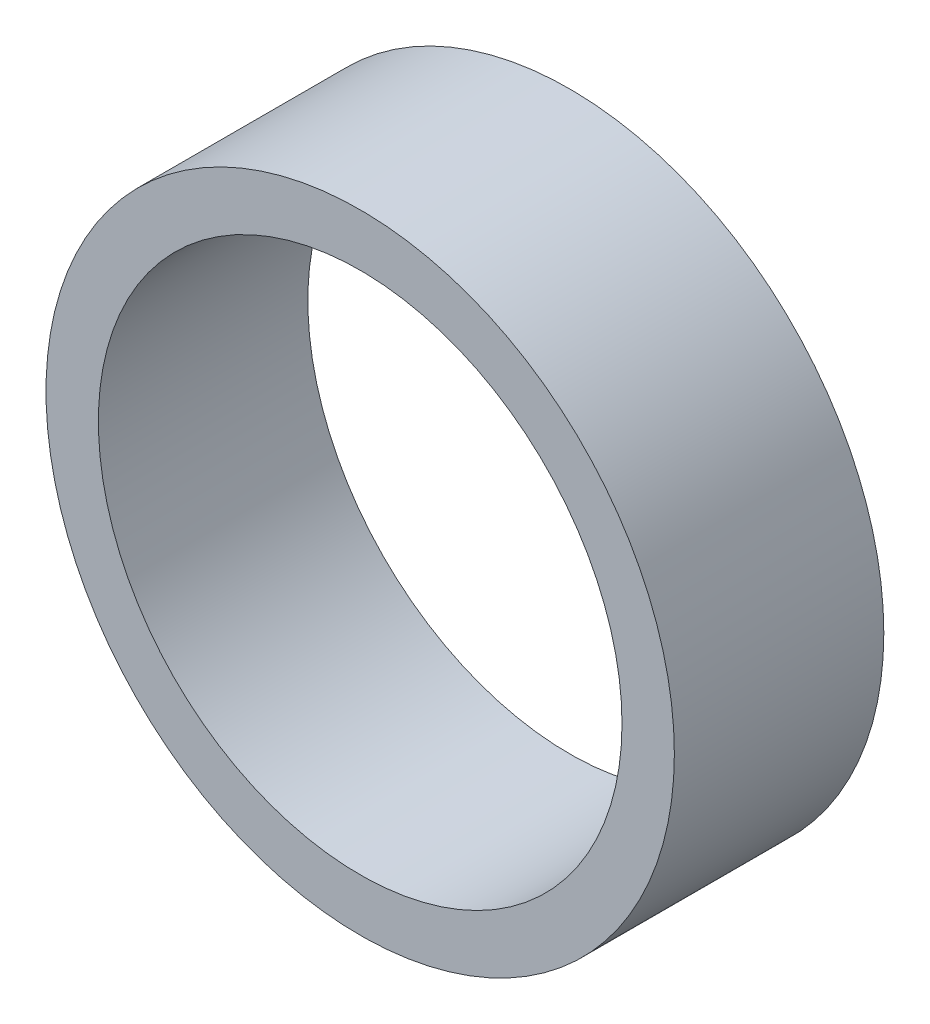
ISO-10303-21;
HEADER;
FILE_DESCRIPTION(('STEP AP214'),'2;1');
FILE_NAME('part.step','',(''),(''),'','','');
FILE_SCHEMA(('AUTOMOTIVE_DESIGN { 1 0 10303 214 1 1 1 1 }'));
ENDSEC;
DATA;
#1=APPLICATION_CONTEXT('core data for automotive mechanical design processes');
#2=APPLICATION_PROTOCOL_DEFINITION('international standard','automotive_design',2000,#1);
#3=PRODUCT_CONTEXT('',#1,'mechanical');
#4=PRODUCT('Part','Part','',(#3));
#5=PRODUCT_RELATED_PRODUCT_CATEGORY('part','',(#4));
#6=PRODUCT_DEFINITION_FORMATION('','',#4);
#7=PRODUCT_DEFINITION_CONTEXT('part definition',#1,'design');
#8=PRODUCT_DEFINITION('design','',#6,#7);
#9=PRODUCT_DEFINITION_SHAPE('','',#8);
#10=(LENGTH_UNIT() NAMED_UNIT(*) SI_UNIT(.MILLI.,.METRE.));
#11=(NAMED_UNIT(*) PLANE_ANGLE_UNIT() SI_UNIT($,.RADIAN.));
#12=(NAMED_UNIT(*) SI_UNIT($,.STERADIAN.) SOLID_ANGLE_UNIT());
#13=UNCERTAINTY_MEASURE_WITH_UNIT(LENGTH_MEASURE(1.E-05),#10,'distance_accuracy_value','');
#14=(GEOMETRIC_REPRESENTATION_CONTEXT(3) GLOBAL_UNCERTAINTY_ASSIGNED_CONTEXT((#13)) GLOBAL_UNIT_ASSIGNED_CONTEXT((#10,
#11,#12)) REPRESENTATION_CONTEXT('',''));
#15=CARTESIAN_POINT('',(0.,0.,0.));
#16=DIRECTION('',(0.,0.,1.));
#17=DIRECTION('',(1.,0.,0.));
#18=AXIS2_PLACEMENT_3D('',#15,#16,#17);
#19=CARTESIAN_POINT('',(0.,0.,5.));
#20=DIRECTION('',(0.,0.,1.));
#21=DIRECTION('',(1.,0.,0.));
#22=AXIS2_PLACEMENT_3D('',#19,#20,#21);
#23=PLANE('',#22);
#24=CARTESIAN_POINT('',(0.,0.,5.));
#25=DIRECTION('',(0.,0.,1.));
#26=DIRECTION('',(1.,0.,0.));
#27=AXIS2_PLACEMENT_3D('',#24,#25,#26);
#28=CIRCLE('',#27,7.5);
#29=CARTESIAN_POINT('',(7.5,0.,5.));
#30=VERTEX_POINT('',#29);
#31=EDGE_CURVE('E10',#30,#30,#28,.T.);
#32=ORIENTED_EDGE('',*,*,#31,.T.);
#33=EDGE_LOOP('',(#32));
#34=FACE_BOUND('',#33,.T.);
#35=CARTESIAN_POINT('',(0.,0.,5.));
#36=DIRECTION('',(0.,0.,1.));
#37=DIRECTION('',(1.,0.,0.));
#38=AXIS2_PLACEMENT_3D('',#35,#36,#37);
#39=CIRCLE('',#38,6.25);
#40=CARTESIAN_POINT('',(6.25,0.,5.));
#41=VERTEX_POINT('',#40);
#42=EDGE_CURVE('E48',#41,#41,#39,.T.);
#43=ORIENTED_EDGE('',*,*,#42,.F.);
#44=EDGE_LOOP('',(#43));
#45=FACE_BOUND('',#44,.T.);
#46=ADVANCED_FACE('F37',(#34,#45),#23,.T.);
#47=CARTESIAN_POINT('',(0.,0.,0.));
#48=DIRECTION('',(0.,0.,1.));
#49=DIRECTION('',(1.,0.,0.));
#50=AXIS2_PLACEMENT_3D('',#47,#48,#49);
#51=PLANE('',#50);
#52=CARTESIAN_POINT('',(0.,0.,0.));
#53=DIRECTION('',(0.,0.,1.));
#54=DIRECTION('',(1.,0.,0.));
#55=AXIS2_PLACEMENT_3D('',#52,#53,#54);
#56=CIRCLE('',#55,7.5);
#57=CARTESIAN_POINT('',(7.5,0.,0.));
#58=VERTEX_POINT('',#57);
#59=EDGE_CURVE('E41',#58,#58,#56,.T.);
#60=ORIENTED_EDGE('',*,*,#59,.F.);
#61=EDGE_LOOP('',(#60));
#62=FACE_BOUND('',#61,.T.);
#63=CARTESIAN_POINT('',(0.,0.,0.));
#64=DIRECTION('',(0.,0.,1.));
#65=DIRECTION('',(1.,0.,0.));
#66=AXIS2_PLACEMENT_3D('',#63,#64,#65);
#67=CIRCLE('',#66,6.25);
#68=CARTESIAN_POINT('',(6.25,0.,0.));
#69=VERTEX_POINT('',#68);
#70=EDGE_CURVE('E50',#69,#69,#67,.T.);
#71=ORIENTED_EDGE('',*,*,#70,.T.);
#72=EDGE_LOOP('',(#71));
#73=FACE_BOUND('',#72,.T.);
#74=ADVANCED_FACE('F60',(#62,#73),#51,.F.);
#75=CARTESIAN_POINT('',(0.,0.,5.));
#76=DIRECTION('',(0.,0.,-1.));
#77=DIRECTION('',(-1.,0.,0.));
#78=AXIS2_PLACEMENT_3D('',#75,#76,#77);
#79=CYLINDRICAL_SURFACE('',#78,7.5);
#80=ORIENTED_EDGE('',*,*,#31,.F.);
#81=EDGE_LOOP('',(#80));
#82=FACE_BOUND('',#81,.T.);
#83=ORIENTED_EDGE('',*,*,#59,.T.);
#84=EDGE_LOOP('',(#83));
#85=FACE_BOUND('',#84,.T.);
#86=ADVANCED_FACE('F39',(#82,#85),#79,.T.);
#87=CARTESIAN_POINT('',(0.,0.,5.));
#88=DIRECTION('',(0.,0.,-1.));
#89=DIRECTION('',(-1.,0.,0.));
#90=AXIS2_PLACEMENT_3D('',#87,#88,#89);
#91=CYLINDRICAL_SURFACE('',#90,6.25);
#92=ORIENTED_EDGE('',*,*,#42,.T.);
#93=EDGE_LOOP('',(#92));
#94=FACE_BOUND('',#93,.T.);
#95=ORIENTED_EDGE('',*,*,#70,.F.);
#96=EDGE_LOOP('',(#95));
#97=FACE_BOUND('',#96,.T.);
#98=ADVANCED_FACE('F56',(#94,#97),#91,.F.);
#99=CLOSED_SHELL('',(#46,#74,#86,#98));
#100=MANIFOLD_SOLID_BREP('B2',#99);
#101=ADVANCED_BREP_SHAPE_REPRESENTATION('',(#18,#100),#14);
#102=SHAPE_DEFINITION_REPRESENTATION(#9,#101);
ENDSEC;
END-ISO-10303-21;
